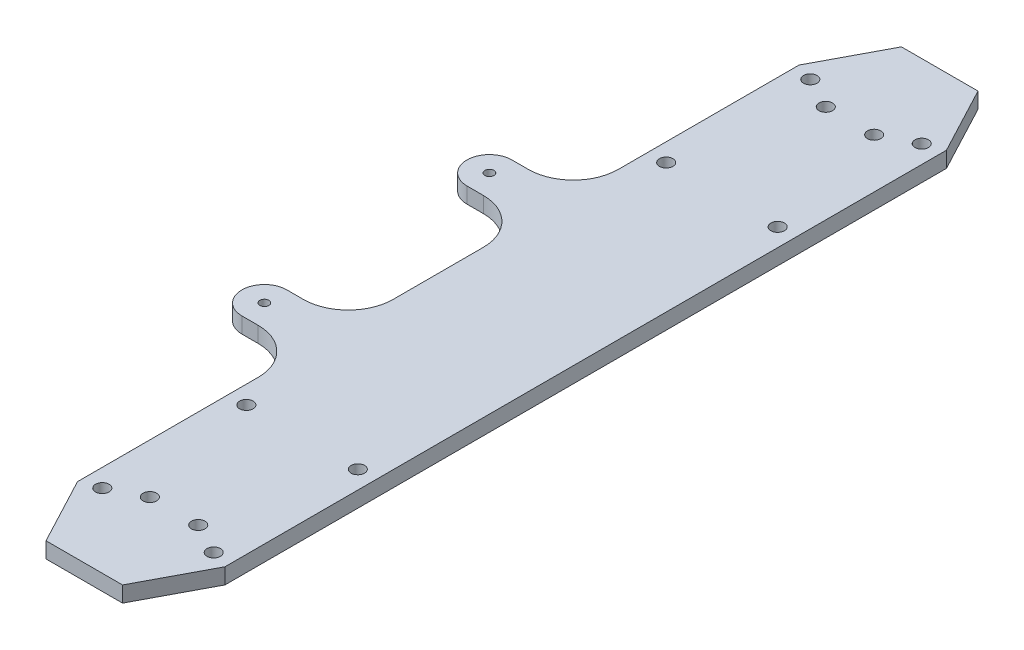
ISO-10303-21;
HEADER;
FILE_DESCRIPTION(('STEP AP214'),'2;1');
FILE_NAME('part.step','',(''),(''),'','','');
FILE_SCHEMA(('AUTOMOTIVE_DESIGN { 1 0 10303 214 1 1 1 1 }'));
ENDSEC;
DATA;
#1=APPLICATION_CONTEXT('core data for automotive mechanical design processes');
#2=APPLICATION_PROTOCOL_DEFINITION('international standard','automotive_design',2000,#1);
#3=PRODUCT_CONTEXT('',#1,'mechanical');
#4=PRODUCT('Part','Part','',(#3));
#5=PRODUCT_RELATED_PRODUCT_CATEGORY('part','',(#4));
#6=PRODUCT_DEFINITION_FORMATION('','',#4);
#7=PRODUCT_DEFINITION_CONTEXT('part definition',#1,'design');
#8=PRODUCT_DEFINITION('design','',#6,#7);
#9=PRODUCT_DEFINITION_SHAPE('','',#8);
#10=(LENGTH_UNIT() NAMED_UNIT(*) SI_UNIT(.MILLI.,.METRE.));
#11=(NAMED_UNIT(*) PLANE_ANGLE_UNIT() SI_UNIT($,.RADIAN.));
#12=(NAMED_UNIT(*) SI_UNIT($,.STERADIAN.) SOLID_ANGLE_UNIT());
#13=UNCERTAINTY_MEASURE_WITH_UNIT(LENGTH_MEASURE(1.E-05),#10,'distance_accuracy_value','');
#14=(GEOMETRIC_REPRESENTATION_CONTEXT(3) GLOBAL_UNCERTAINTY_ASSIGNED_CONTEXT((#13)) GLOBAL_UNIT_ASSIGNED_CONTEXT((#10,
#11,#12)) REPRESENTATION_CONTEXT('',''));
#15=CARTESIAN_POINT('',(0.,0.,0.));
#16=DIRECTION('',(0.,0.,1.));
#17=DIRECTION('',(1.,0.,0.));
#18=AXIS2_PLACEMENT_3D('',#15,#16,#17);
#19=CARTESIAN_POINT('',(-26.375,3.5,-9.995));
#20=DIRECTION('',(0.,-1.,0.));
#21=DIRECTION('',(0.,0.,-1.));
#22=AXIS2_PLACEMENT_3D('',#19,#20,#21);
#23=CYLINDRICAL_SURFACE('',#22,10.);
#24=DIRECTION('',(0.,-1.,0.));
#25=VECTOR('',#24,1.);
#26=CARTESIAN_POINT('',(-16.375,3.5,-9.995));
#27=LINE('',#26,#25);
#28=CARTESIAN_POINT('',(-16.375,3.5,-9.995));
#29=VERTEX_POINT('',#28);
#30=CARTESIAN_POINT('',(-16.375,0.,-9.995));
#31=VERTEX_POINT('',#30);
#32=EDGE_CURVE('E399',#29,#31,#27,.T.);
#33=ORIENTED_EDGE('',*,*,#32,.F.);
#34=CARTESIAN_POINT('',(-26.375,3.5,-9.995));
#35=DIRECTION('',(0.,-1.,0.));
#36=DIRECTION('',(0.,0.,-1.));
#37=AXIS2_PLACEMENT_3D('',#34,#35,#36);
#38=CIRCLE('',#37,10.);
#39=CARTESIAN_POINT('',(-26.375,3.5,-19.995));
#40=VERTEX_POINT('',#39);
#41=EDGE_CURVE('E43',#29,#40,#38,.F.);
#42=ORIENTED_EDGE('',*,*,#41,.T.);
#43=DIRECTION('',(0.,-1.,0.));
#44=VECTOR('',#43,1.);
#45=CARTESIAN_POINT('',(-26.375,24.6441930562507,-19.995));
#46=LINE('',#45,#44);
#47=CARTESIAN_POINT('',(-26.375,0.,-19.995));
#48=VERTEX_POINT('',#47);
#49=EDGE_CURVE('E402',#48,#40,#46,.F.);
#50=ORIENTED_EDGE('',*,*,#49,.F.);
#51=CARTESIAN_POINT('',(-26.375,0.,-9.995));
#52=DIRECTION('',(0.,-1.,0.));
#53=DIRECTION('',(0.,0.,-1.));
#54=AXIS2_PLACEMENT_3D('',#51,#52,#53);
#55=CIRCLE('',#54,10.);
#56=EDGE_CURVE('E11',#48,#31,#55,.T.);
#57=ORIENTED_EDGE('',*,*,#56,.T.);
#58=EDGE_LOOP('',(#33,#42,#50,#57));
#59=FACE_BOUND('',#58,.T.);
#60=ADVANCED_FACE('F36',(#59),#23,.F.);
#61=CARTESIAN_POINT('',(-26.375,3.5,-39.995));
#62=DIRECTION('',(0.,-1.,0.));
#63=DIRECTION('',(0.,0.,-1.));
#64=AXIS2_PLACEMENT_3D('',#61,#62,#63);
#65=CYLINDRICAL_SURFACE('',#64,10.);
#66=DIRECTION('',(0.,1.,0.));
#67=VECTOR('',#66,1.);
#68=CARTESIAN_POINT('',(-16.375,3.5,-39.995));
#69=LINE('',#68,#67);
#70=CARTESIAN_POINT('',(-16.375,0.,-39.995));
#71=VERTEX_POINT('',#70);
#72=CARTESIAN_POINT('',(-16.375,3.5,-39.995));
#73=VERTEX_POINT('',#72);
#74=EDGE_CURVE('E391',#71,#73,#69,.T.);
#75=ORIENTED_EDGE('',*,*,#74,.F.);
#76=CARTESIAN_POINT('',(-26.375,0.,-39.995));
#77=DIRECTION('',(0.,-1.,0.));
#78=DIRECTION('',(0.,0.,-1.));
#79=AXIS2_PLACEMENT_3D('',#76,#77,#78);
#80=CIRCLE('',#79,10.);
#81=CARTESIAN_POINT('',(-26.375,0.,-29.995));
#82=VERTEX_POINT('',#81);
#83=EDGE_CURVE('E395',#71,#82,#80,.T.);
#84=ORIENTED_EDGE('',*,*,#83,.T.);
#85=DIRECTION('',(0.,1.,0.));
#86=VECTOR('',#85,1.);
#87=CARTESIAN_POINT('',(-26.375,3.5,-29.995));
#88=LINE('',#87,#86);
#89=CARTESIAN_POINT('',(-26.375,3.5,-29.995));
#90=VERTEX_POINT('',#89);
#91=EDGE_CURVE('E176',#90,#82,#88,.F.);
#92=ORIENTED_EDGE('',*,*,#91,.F.);
#93=CARTESIAN_POINT('',(-26.375,3.5,-39.995));
#94=DIRECTION('',(0.,-1.,0.));
#95=DIRECTION('',(0.,0.,-1.));
#96=AXIS2_PLACEMENT_3D('',#93,#94,#95);
#97=CIRCLE('',#96,10.);
#98=EDGE_CURVE('E397',#90,#73,#97,.F.);
#99=ORIENTED_EDGE('',*,*,#98,.T.);
#100=EDGE_LOOP('',(#75,#84,#92,#99));
#101=FACE_BOUND('',#100,.T.);
#102=ADVANCED_FACE('F434',(#101),#65,.F.);
#103=CARTESIAN_POINT('',(-16.375,3.5,95.0000000000001));
#104=DIRECTION('',(1.,0.,0.));
#105=DIRECTION('',(0.,0.,-1.));
#106=AXIS2_PLACEMENT_3D('',#103,#104,#105);
#107=PLANE('',#106);
#108=DIRECTION('',(0.,0.,1.));
#109=VECTOR('',#108,1.);
#110=CARTESIAN_POINT('',(-16.375,0.,95.0000000000001));
#111=LINE('',#110,#109);
#112=CARTESIAN_POINT('',(-16.375,0.,-80.125));
#113=VERTEX_POINT('',#112);
#114=EDGE_CURVE('E360',#113,#71,#111,.T.);
#115=ORIENTED_EDGE('',*,*,#114,.T.);
#116=ORIENTED_EDGE('',*,*,#74,.T.);
#117=DIRECTION('',(0.,0.,1.));
#118=VECTOR('',#117,1.);
#119=CARTESIAN_POINT('',(-16.375,3.5,95.0000000000001));
#120=LINE('',#119,#118);
#121=CARTESIAN_POINT('',(-16.375,3.5,-80.125));
#122=VERTEX_POINT('',#121);
#123=EDGE_CURVE('E347',#122,#73,#120,.T.);
#124=ORIENTED_EDGE('',*,*,#123,.F.);
#125=DIRECTION('',(0.,1.,0.));
#126=VECTOR('',#125,1.);
#127=CARTESIAN_POINT('',(-16.375,0.,-80.125));
#128=LINE('',#127,#126);
#129=EDGE_CURVE('E298',#113,#122,#128,.T.);
#130=ORIENTED_EDGE('',*,*,#129,.F.);
#131=EDGE_LOOP('',(#115,#116,#124,#130));
#132=FACE_BOUND('',#131,.T.);
#133=ADVANCED_FACE('F431',(#132),#107,.F.);
#134=CARTESIAN_POINT('',(-26.375,24.6441930562507,9.995));
#135=DIRECTION('',(0.,1.,0.));
#136=DIRECTION('',(0.,0.,1.));
#137=AXIS2_PLACEMENT_3D('',#134,#135,#136);
#138=CYLINDRICAL_SURFACE('',#137,10.);
#139=DIRECTION('',(0.,-1.,0.));
#140=VECTOR('',#139,1.);
#141=CARTESIAN_POINT('',(-26.375,24.6441930562507,19.995));
#142=LINE('',#141,#140);
#143=CARTESIAN_POINT('',(-26.375,3.5,19.995));
#144=VERTEX_POINT('',#143);
#145=CARTESIAN_POINT('',(-26.375,0.,19.995));
#146=VERTEX_POINT('',#145);
#147=EDGE_CURVE('E380',#144,#146,#142,.T.);
#148=ORIENTED_EDGE('',*,*,#147,.F.);
#149=CARTESIAN_POINT('',(-26.375,3.5,9.995));
#150=DIRECTION('',(0.,-1.,0.));
#151=DIRECTION('',(0.,0.,-1.));
#152=AXIS2_PLACEMENT_3D('',#149,#150,#151);
#153=CIRCLE('',#152,10.);
#154=CARTESIAN_POINT('',(-16.375,3.5,9.995));
#155=VERTEX_POINT('',#154);
#156=EDGE_CURVE('E386',#144,#155,#153,.F.);
#157=ORIENTED_EDGE('',*,*,#156,.T.);
#158=DIRECTION('',(0.,-1.,0.));
#159=VECTOR('',#158,1.);
#160=CARTESIAN_POINT('',(-16.375,24.6441930562507,9.995));
#161=LINE('',#160,#159);
#162=CARTESIAN_POINT('',(-16.375,0.,9.995));
#163=VERTEX_POINT('',#162);
#164=EDGE_CURVE('E383',#163,#155,#161,.F.);
#165=ORIENTED_EDGE('',*,*,#164,.F.);
#166=CARTESIAN_POINT('',(-26.375,0.,9.995));
#167=DIRECTION('',(0.,-1.,0.));
#168=DIRECTION('',(0.,0.,-1.));
#169=AXIS2_PLACEMENT_3D('',#166,#167,#168);
#170=CIRCLE('',#169,10.);
#171=EDGE_CURVE('E389',#163,#146,#170,.T.);
#172=ORIENTED_EDGE('',*,*,#171,.T.);
#173=EDGE_LOOP('',(#148,#157,#165,#172));
#174=FACE_BOUND('',#173,.T.);
#175=ADVANCED_FACE('F456',(#174),#138,.F.);
#176=CARTESIAN_POINT('',(-26.375,24.6441930562507,39.995));
#177=DIRECTION('',(0.,1.,0.));
#178=DIRECTION('',(0.,0.,1.));
#179=AXIS2_PLACEMENT_3D('',#176,#177,#178);
#180=CYLINDRICAL_SURFACE('',#179,10.);
#181=DIRECTION('',(0.,1.,0.));
#182=VECTOR('',#181,1.);
#183=CARTESIAN_POINT('',(-26.375,24.6441930562507,29.995));
#184=LINE('',#183,#182);
#185=CARTESIAN_POINT('',(-26.375,0.,29.995));
#186=VERTEX_POINT('',#185);
#187=CARTESIAN_POINT('',(-26.375,3.5,29.995));
#188=VERTEX_POINT('',#187);
#189=EDGE_CURVE('E359',#186,#188,#184,.T.);
#190=ORIENTED_EDGE('',*,*,#189,.F.);
#191=CARTESIAN_POINT('',(-26.375,0.,39.995));
#192=DIRECTION('',(0.,-1.,0.));
#193=DIRECTION('',(0.,0.,-1.));
#194=AXIS2_PLACEMENT_3D('',#191,#192,#193);
#195=CIRCLE('',#194,10.);
#196=CARTESIAN_POINT('',(-16.375,0.,39.995));
#197=VERTEX_POINT('',#196);
#198=EDGE_CURVE('E376',#186,#197,#195,.T.);
#199=ORIENTED_EDGE('',*,*,#198,.T.);
#200=DIRECTION('',(0.,1.,0.));
#201=VECTOR('',#200,1.);
#202=CARTESIAN_POINT('',(-16.375,3.5,39.995));
#203=LINE('',#202,#201);
#204=CARTESIAN_POINT('',(-16.375,3.5,39.995));
#205=VERTEX_POINT('',#204);
#206=EDGE_CURVE('E373',#205,#197,#203,.F.);
#207=ORIENTED_EDGE('',*,*,#206,.F.);
#208=CARTESIAN_POINT('',(-26.375,3.5,39.995));
#209=DIRECTION('',(0.,-1.,0.));
#210=DIRECTION('',(0.,0.,-1.));
#211=AXIS2_PLACEMENT_3D('',#208,#209,#210);
#212=CIRCLE('',#211,10.);
#213=EDGE_CURVE('E378',#205,#188,#212,.F.);
#214=ORIENTED_EDGE('',*,*,#213,.T.);
#215=EDGE_LOOP('',(#190,#199,#207,#214));
#216=FACE_BOUND('',#215,.T.);
#217=ADVANCED_FACE('F427',(#216),#180,.F.);
#218=EDGE_CURVE('E351',#29,#155,#120,.T.);
#219=ORIENTED_EDGE('',*,*,#218,.F.);
#220=ORIENTED_EDGE('',*,*,#32,.T.);
#221=EDGE_CURVE('E364',#31,#163,#111,.T.);
#222=ORIENTED_EDGE('',*,*,#221,.T.);
#223=ORIENTED_EDGE('',*,*,#164,.T.);
#224=EDGE_LOOP('',(#219,#220,#222,#223));
#225=FACE_BOUND('',#224,.T.);
#226=ADVANCED_FACE('F419',(#225),#107,.F.);
#227=CARTESIAN_POINT('',(0.,3.5,0.));
#228=DIRECTION('',(0.,-1.,0.));
#229=DIRECTION('',(0.,0.,-1.));
#230=AXIS2_PLACEMENT_3D('',#227,#228,#229);
#231=PLANE('',#230);
#232=DIRECTION('',(0.,0.,-1.));
#233=VECTOR('',#232,1.);
#234=CARTESIAN_POINT('',(16.375,3.5,95.0000000000001));
#235=LINE('',#234,#233);
#236=CARTESIAN_POINT('',(16.375,3.5,80.125));
#237=VERTEX_POINT('',#236);
#238=CARTESIAN_POINT('',(16.375,3.5,-80.125));
#239=VERTEX_POINT('',#238);
#240=EDGE_CURVE('E355',#237,#239,#235,.T.);
#241=ORIENTED_EDGE('',*,*,#240,.T.);
#242=DIRECTION('',(-0.467887720419032,0.,-0.883787916347062));
#243=VECTOR('',#242,1.);
#244=CARTESIAN_POINT('',(45.9229729729729,3.5,-24.3121621621621));
#245=LINE('',#244,#243);
#246=CARTESIAN_POINT('',(8.5,3.5,-95.0000000000001));
#247=VERTEX_POINT('',#246);
#248=EDGE_CURVE('E261',#239,#247,#245,.T.);
#249=ORIENTED_EDGE('',*,*,#248,.T.);
#250=DIRECTION('',(-1.,0.,0.));
#251=VECTOR('',#250,1.);
#252=CARTESIAN_POINT('',(-16.375,3.5,-94.9999999999999));
#253=LINE('',#252,#251);
#254=CARTESIAN_POINT('',(-8.5,3.5,-94.9999999999999));
#255=VERTEX_POINT('',#254);
#256=EDGE_CURVE('E357',#247,#255,#253,.T.);
#257=ORIENTED_EDGE('',*,*,#256,.T.);
#258=DIRECTION('',(0.467887720419032,0.,-0.883787916347062));
#259=VECTOR('',#258,1.);
#260=CARTESIAN_POINT('',(-45.9229729729729,3.5,-24.3121621621621));
#261=LINE('',#260,#259);
#262=EDGE_CURVE('E283',#122,#255,#261,.T.);
#263=ORIENTED_EDGE('',*,*,#262,.F.);
#264=ORIENTED_EDGE('',*,*,#123,.T.);
#265=ORIENTED_EDGE('',*,*,#98,.F.);
#266=DIRECTION('',(1.,0.,0.));
#267=VECTOR('',#266,1.);
#268=CARTESIAN_POINT('',(0.,3.5,-29.995));
#269=LINE('',#268,#267);
#270=CARTESIAN_POINT('',(-30.005,3.5,-29.995));
#271=VERTEX_POINT('',#270);
#272=EDGE_CURVE('E201',#271,#90,#269,.T.);
#273=ORIENTED_EDGE('',*,*,#272,.F.);
#274=CARTESIAN_POINT('',(-30.005,3.5,-24.995));
#275=DIRECTION('',(0.,-1.,0.));
#276=DIRECTION('',(0.,0.,-1.));
#277=AXIS2_PLACEMENT_3D('',#274,#275,#276);
#278=CIRCLE('',#277,5.);
#279=CARTESIAN_POINT('',(-30.005,3.5,-19.995));
#280=VERTEX_POINT('',#279);
#281=EDGE_CURVE('E186',#280,#271,#278,.T.);
#282=ORIENTED_EDGE('',*,*,#281,.F.);
#283=DIRECTION('',(1.,0.,0.));
#284=VECTOR('',#283,1.);
#285=CARTESIAN_POINT('',(0.,3.5,-19.995));
#286=LINE('',#285,#284);
#287=EDGE_CURVE('E204',#280,#40,#286,.T.);
#288=ORIENTED_EDGE('',*,*,#287,.T.);
#289=ORIENTED_EDGE('',*,*,#41,.F.);
#290=ORIENTED_EDGE('',*,*,#218,.T.);
#291=ORIENTED_EDGE('',*,*,#156,.F.);
#292=DIRECTION('',(1.,0.,0.));
#293=VECTOR('',#292,1.);
#294=CARTESIAN_POINT('',(0.,3.5,19.995));
#295=LINE('',#294,#293);
#296=CARTESIAN_POINT('',(-30.005,3.5,19.995));
#297=VERTEX_POINT('',#296);
#298=EDGE_CURVE('E209',#297,#144,#295,.T.);
#299=ORIENTED_EDGE('',*,*,#298,.F.);
#300=CARTESIAN_POINT('',(-30.005,3.5,24.995));
#301=DIRECTION('',(0.,-1.,0.));
#302=DIRECTION('',(0.,0.,-1.));
#303=AXIS2_PLACEMENT_3D('',#300,#301,#302);
#304=CIRCLE('',#303,5.);
#305=CARTESIAN_POINT('',(-30.005,3.5,29.995));
#306=VERTEX_POINT('',#305);
#307=EDGE_CURVE('E208',#297,#306,#304,.F.);
#308=ORIENTED_EDGE('',*,*,#307,.T.);
#309=DIRECTION('',(1.,0.,0.));
#310=VECTOR('',#309,1.);
#311=CARTESIAN_POINT('',(0.,3.5,29.995));
#312=LINE('',#311,#310);
#313=EDGE_CURVE('E205',#306,#188,#312,.T.);
#314=ORIENTED_EDGE('',*,*,#313,.T.);
#315=ORIENTED_EDGE('',*,*,#213,.F.);
#316=CARTESIAN_POINT('',(-16.375,3.5,80.125));
#317=VERTEX_POINT('',#316);
#318=EDGE_CURVE('E352',#205,#317,#120,.T.);
#319=ORIENTED_EDGE('',*,*,#318,.T.);
#320=DIRECTION('',(0.467887720419032,0.,0.883787916347062));
#321=VECTOR('',#320,1.);
#322=CARTESIAN_POINT('',(-45.9229729729729,3.5,24.3121621621621));
#323=LINE('',#322,#321);
#324=CARTESIAN_POINT('',(-8.5,3.5,95.0000000000001));
#325=VERTEX_POINT('',#324);
#326=EDGE_CURVE('E328',#317,#325,#323,.T.);
#327=ORIENTED_EDGE('',*,*,#326,.T.);
#328=DIRECTION('',(1.,0.,0.));
#329=VECTOR('',#328,1.);
#330=CARTESIAN_POINT('',(-16.375,3.5,95.0000000000001));
#331=LINE('',#330,#329);
#332=CARTESIAN_POINT('',(8.5,3.5,95.0000000000001));
#333=VERTEX_POINT('',#332);
#334=EDGE_CURVE('E350',#325,#333,#331,.T.);
#335=ORIENTED_EDGE('',*,*,#334,.T.);
#336=DIRECTION('',(-0.467887720419032,0.,0.883787916347062));
#337=VECTOR('',#336,1.);
#338=CARTESIAN_POINT('',(45.9229729729729,3.5,24.3121621621621));
#339=LINE('',#338,#337);
#340=EDGE_CURVE('E306',#237,#333,#339,.T.);
#341=ORIENTED_EDGE('',*,*,#340,.F.);
#342=EDGE_LOOP('',(#241,#249,#257,#263,#264,#265,#273,#282,#288,#289,#290,#291,#299,#308,#314,
#315,#319,#327,#335,#341));
#343=FACE_BOUND('',#342,.T.);
#344=CARTESIAN_POINT('',(-5.375,3.5,-75.065));
#345=DIRECTION('',(0.,1.,0.));
#346=DIRECTION('',(0.,0.,-1.));
#347=AXIS2_PLACEMENT_3D('',#344,#345,#346);
#348=CIRCLE('',#347,1.5);
#349=CARTESIAN_POINT('',(-5.375,3.5,-76.565));
#350=VERTEX_POINT('',#349);
#351=EDGE_CURVE('E214',#350,#350,#348,.T.);
#352=ORIENTED_EDGE('',*,*,#351,.F.);
#353=EDGE_LOOP('',(#352));
#354=FACE_BOUND('',#353,.T.);
#355=CARTESIAN_POINT('',(5.375,3.5,-75.065));
#356=DIRECTION('',(0.,-1.,0.));
#357=DIRECTION('',(0.,0.,-1.));
#358=AXIS2_PLACEMENT_3D('',#355,#356,#357);
#359=CIRCLE('',#358,1.5);
#360=CARTESIAN_POINT('',(5.375,3.5,-76.565));
#361=VERTEX_POINT('',#360);
#362=EDGE_CURVE('E237',#361,#361,#359,.T.);
#363=ORIENTED_EDGE('',*,*,#362,.T.);
#364=EDGE_LOOP('',(#363));
#365=FACE_BOUND('',#364,.T.);
#366=CARTESIAN_POINT('',(-5.375,3.5,75.065));
#367=DIRECTION('',(0.,-1.,0.));
#368=DIRECTION('',(0.,0.,1.));
#369=AXIS2_PLACEMENT_3D('',#366,#367,#368);
#370=CIRCLE('',#369,1.5);
#371=CARTESIAN_POINT('',(-5.375,3.5,76.565));
#372=VERTEX_POINT('',#371);
#373=EDGE_CURVE('E243',#372,#372,#370,.T.);
#374=ORIENTED_EDGE('',*,*,#373,.T.);
#375=EDGE_LOOP('',(#374));
#376=FACE_BOUND('',#375,.T.);
#377=CARTESIAN_POINT('',(5.375,3.5,75.065));
#378=DIRECTION('',(0.,1.,0.));
#379=DIRECTION('',(0.,0.,1.));
#380=AXIS2_PLACEMENT_3D('',#377,#378,#379);
#381=CIRCLE('',#380,1.5);
#382=CARTESIAN_POINT('',(5.375,3.5,76.565));
#383=VERTEX_POINT('',#382);
#384=EDGE_CURVE('E249',#383,#383,#381,.T.);
#385=ORIENTED_EDGE('',*,*,#384,.F.);
#386=EDGE_LOOP('',(#385));
#387=FACE_BOUND('',#386,.T.);
#388=CARTESIAN_POINT('',(12.375,3.5,-46.625));
#389=DIRECTION('',(0.,1.,0.));
#390=DIRECTION('',(0.,0.,-1.));
#391=AXIS2_PLACEMENT_3D('',#388,#389,#390);
#392=CIRCLE('',#391,1.5);
#393=CARTESIAN_POINT('',(12.375,3.5,-48.125));
#394=VERTEX_POINT('',#393);
#395=EDGE_CURVE('E255',#394,#394,#392,.T.);
#396=ORIENTED_EDGE('',*,*,#395,.F.);
#397=EDGE_LOOP('',(#396));
#398=FACE_BOUND('',#397,.T.);
#399=CARTESIAN_POINT('',(12.375,3.5,-78.625));
#400=DIRECTION('',(0.,1.,0.));
#401=DIRECTION('',(0.,0.,-1.));
#402=AXIS2_PLACEMENT_3D('',#399,#400,#401);
#403=CIRCLE('',#402,1.5);
#404=CARTESIAN_POINT('',(12.375,3.5,-80.125));
#405=VERTEX_POINT('',#404);
#406=EDGE_CURVE('E262',#405,#405,#403,.T.);
#407=ORIENTED_EDGE('',*,*,#406,.F.);
#408=EDGE_LOOP('',(#407));
#409=FACE_BOUND('',#408,.T.);
#410=CARTESIAN_POINT('',(-12.375,3.5,-46.625));
#411=DIRECTION('',(0.,-1.,0.));
#412=DIRECTION('',(0.,0.,-1.));
#413=AXIS2_PLACEMENT_3D('',#410,#411,#412);
#414=CIRCLE('',#413,1.5);
#415=CARTESIAN_POINT('',(-12.375,3.5,-48.125));
#416=VERTEX_POINT('',#415);
#417=EDGE_CURVE('E277',#416,#416,#414,.T.);
#418=ORIENTED_EDGE('',*,*,#417,.T.);
#419=EDGE_LOOP('',(#418));
#420=FACE_BOUND('',#419,.T.);
#421=CARTESIAN_POINT('',(-12.375,3.5,-78.625));
#422=DIRECTION('',(0.,-1.,0.));
#423=DIRECTION('',(0.,0.,-1.));
#424=AXIS2_PLACEMENT_3D('',#421,#422,#423);
#425=CIRCLE('',#424,1.5);
#426=CARTESIAN_POINT('',(-12.375,3.5,-80.125));
#427=VERTEX_POINT('',#426);
#428=EDGE_CURVE('E284',#427,#427,#425,.T.);
#429=ORIENTED_EDGE('',*,*,#428,.T.);
#430=EDGE_LOOP('',(#429));
#431=FACE_BOUND('',#430,.T.);
#432=CARTESIAN_POINT('',(12.375,3.5,46.625));
#433=DIRECTION('',(0.,-1.,0.));
#434=DIRECTION('',(0.,0.,1.));
#435=AXIS2_PLACEMENT_3D('',#432,#433,#434);
#436=CIRCLE('',#435,1.5);
#437=CARTESIAN_POINT('',(12.375,3.5,48.125));
#438=VERTEX_POINT('',#437);
#439=EDGE_CURVE('E300',#438,#438,#436,.T.);
#440=ORIENTED_EDGE('',*,*,#439,.T.);
#441=EDGE_LOOP('',(#440));
#442=FACE_BOUND('',#441,.T.);
#443=CARTESIAN_POINT('',(12.375,3.5,78.625));
#444=DIRECTION('',(0.,-1.,0.));
#445=DIRECTION('',(0.,0.,1.));
#446=AXIS2_PLACEMENT_3D('',#443,#444,#445);
#447=CIRCLE('',#446,1.5);
#448=CARTESIAN_POINT('',(12.375,3.5,80.125));
#449=VERTEX_POINT('',#448);
#450=EDGE_CURVE('E307',#449,#449,#447,.T.);
#451=ORIENTED_EDGE('',*,*,#450,.T.);
#452=EDGE_LOOP('',(#451));
#453=FACE_BOUND('',#452,.T.);
#454=CARTESIAN_POINT('',(-12.375,3.5,78.625));
#455=DIRECTION('',(0.,1.,0.));
#456=DIRECTION('',(0.,0.,1.));
#457=AXIS2_PLACEMENT_3D('',#454,#455,#456);
#458=CIRCLE('',#457,1.5);
#459=CARTESIAN_POINT('',(-12.375,3.5,80.125));
#460=VERTEX_POINT('',#459);
#461=EDGE_CURVE('E325',#460,#460,#458,.T.);
#462=ORIENTED_EDGE('',*,*,#461,.F.);
#463=EDGE_LOOP('',(#462));
#464=FACE_BOUND('',#463,.T.);
#465=CARTESIAN_POINT('',(-12.375,3.5,46.625));
#466=DIRECTION('',(0.,1.,0.));
#467=DIRECTION('',(0.,0.,1.));
#468=AXIS2_PLACEMENT_3D('',#465,#466,#467);
#469=CIRCLE('',#468,1.5);
#470=CARTESIAN_POINT('',(-12.375,3.5,48.125));
#471=VERTEX_POINT('',#470);
#472=EDGE_CURVE('E332',#471,#471,#469,.T.);
#473=ORIENTED_EDGE('',*,*,#472,.F.);
#474=EDGE_LOOP('',(#473));
#475=FACE_BOUND('',#474,.T.);
#476=CARTESIAN_POINT('',(-30.005,3.5,24.995));
#477=DIRECTION('',(0.,-1.,0.));
#478=DIRECTION('',(0.,0.,-1.));
#479=AXIS2_PLACEMENT_3D('',#476,#477,#478);
#480=CIRCLE('',#479,1.);
#481=CARTESIAN_POINT('',(-30.005,3.5,23.995));
#482=VERTEX_POINT('',#481);
#483=EDGE_CURVE('E211',#482,#482,#480,.T.);
#484=ORIENTED_EDGE('',*,*,#483,.T.);
#485=EDGE_LOOP('',(#484));
#486=FACE_BOUND('',#485,.T.);
#487=CARTESIAN_POINT('',(-30.005,3.5,-24.995));
#488=DIRECTION('',(0.,-1.,0.));
#489=DIRECTION('',(0.,0.,-1.));
#490=AXIS2_PLACEMENT_3D('',#487,#488,#489);
#491=CIRCLE('',#490,1.);
#492=CARTESIAN_POINT('',(-30.005,3.5,-25.995));
#493=VERTEX_POINT('',#492);
#494=EDGE_CURVE('E219',#493,#493,#491,.F.);
#495=ORIENTED_EDGE('',*,*,#494,.F.);
#496=EDGE_LOOP('',(#495));
#497=FACE_BOUND('',#496,.T.);
#498=ADVANCED_FACE('F408',(#343,#354,#365,#376,#387,#398,#409,#420,#431,#442,#453,#464,#475,
#486,#497),#231,.F.);
#499=CARTESIAN_POINT('',(0.,0.,0.));
#500=DIRECTION('',(0.,-1.,0.));
#501=DIRECTION('',(0.,0.,-1.));
#502=AXIS2_PLACEMENT_3D('',#499,#500,#501);
#503=PLANE('',#502);
#504=DIRECTION('',(-0.467887720419032,0.,-0.883787916347062));
#505=VECTOR('',#504,1.);
#506=CARTESIAN_POINT('',(45.9229729729729,0.,-24.3121621621621));
#507=LINE('',#506,#505);
#508=CARTESIAN_POINT('',(16.375,0.,-80.125));
#509=VERTEX_POINT('',#508);
#510=CARTESIAN_POINT('',(8.5,0.,-94.9999999999999));
#511=VERTEX_POINT('',#510);
#512=EDGE_CURVE('E270',#509,#511,#507,.T.);
#513=ORIENTED_EDGE('',*,*,#512,.F.);
#514=DIRECTION('',(0.,0.,-1.));
#515=VECTOR('',#514,1.);
#516=CARTESIAN_POINT('',(16.375,0.,95.0000000000001));
#517=LINE('',#516,#515);
#518=CARTESIAN_POINT('',(16.375,0.,80.125));
#519=VERTEX_POINT('',#518);
#520=EDGE_CURVE('E367',#519,#509,#517,.T.);
#521=ORIENTED_EDGE('',*,*,#520,.F.);
#522=DIRECTION('',(-0.467887720419032,0.,0.883787916347062));
#523=VECTOR('',#522,1.);
#524=CARTESIAN_POINT('',(45.9229729729729,0.,24.3121621621621));
#525=LINE('',#524,#523);
#526=CARTESIAN_POINT('',(8.5,0.,95.0000000000001));
#527=VERTEX_POINT('',#526);
#528=EDGE_CURVE('E315',#519,#527,#525,.T.);
#529=ORIENTED_EDGE('',*,*,#528,.T.);
#530=DIRECTION('',(1.,0.,0.));
#531=VECTOR('',#530,1.);
#532=CARTESIAN_POINT('',(-16.375,0.,95.0000000000001));
#533=LINE('',#532,#531);
#534=CARTESIAN_POINT('',(-8.5,0.,95.0000000000001));
#535=VERTEX_POINT('',#534);
#536=EDGE_CURVE('E363',#535,#527,#533,.T.);
#537=ORIENTED_EDGE('',*,*,#536,.F.);
#538=DIRECTION('',(0.467887720419032,0.,0.883787916347062));
#539=VECTOR('',#538,1.);
#540=CARTESIAN_POINT('',(-45.9229729729729,0.,24.3121621621621));
#541=LINE('',#540,#539);
#542=CARTESIAN_POINT('',(-16.375,0.,80.125));
#543=VERTEX_POINT('',#542);
#544=EDGE_CURVE('E337',#543,#535,#541,.T.);
#545=ORIENTED_EDGE('',*,*,#544,.F.);
#546=EDGE_CURVE('E344',#197,#543,#111,.T.);
#547=ORIENTED_EDGE('',*,*,#546,.F.);
#548=ORIENTED_EDGE('',*,*,#198,.F.);
#549=DIRECTION('',(-1.,0.,0.));
#550=VECTOR('',#549,1.);
#551=CARTESIAN_POINT('',(0.,0.,29.995));
#552=LINE('',#551,#550);
#553=CARTESIAN_POINT('',(-30.005,0.,29.995));
#554=VERTEX_POINT('',#553);
#555=EDGE_CURVE('E224',#186,#554,#552,.T.);
#556=ORIENTED_EDGE('',*,*,#555,.T.);
#557=CARTESIAN_POINT('',(-30.005,0.,24.995));
#558=DIRECTION('',(0.,1.,0.));
#559=DIRECTION('',(0.,0.,-1.));
#560=AXIS2_PLACEMENT_3D('',#557,#558,#559);
#561=CIRCLE('',#560,5.);
#562=CARTESIAN_POINT('',(-30.005,0.,19.995));
#563=VERTEX_POINT('',#562);
#564=EDGE_CURVE('E218',#554,#563,#561,.F.);
#565=ORIENTED_EDGE('',*,*,#564,.T.);
#566=DIRECTION('',(-1.,0.,0.));
#567=VECTOR('',#566,1.);
#568=CARTESIAN_POINT('',(0.,0.,19.995));
#569=LINE('',#568,#567);
#570=EDGE_CURVE('E222',#146,#563,#569,.T.);
#571=ORIENTED_EDGE('',*,*,#570,.F.);
#572=ORIENTED_EDGE('',*,*,#171,.F.);
#573=ORIENTED_EDGE('',*,*,#221,.F.);
#574=ORIENTED_EDGE('',*,*,#56,.F.);
#575=DIRECTION('',(-1.,0.,0.));
#576=VECTOR('',#575,1.);
#577=CARTESIAN_POINT('',(0.,0.,-19.995));
#578=LINE('',#577,#576);
#579=CARTESIAN_POINT('',(-30.005,0.,-19.995));
#580=VERTEX_POINT('',#579);
#581=EDGE_CURVE('E178',#48,#580,#578,.T.);
#582=ORIENTED_EDGE('',*,*,#581,.T.);
#583=CARTESIAN_POINT('',(-30.005,0.,-24.995));
#584=DIRECTION('',(0.,-1.,0.));
#585=DIRECTION('',(0.,0.,1.));
#586=AXIS2_PLACEMENT_3D('',#583,#584,#585);
#587=CIRCLE('',#586,5.);
#588=CARTESIAN_POINT('',(-30.005,0.,-29.995));
#589=VERTEX_POINT('',#588);
#590=EDGE_CURVE('E179',#589,#580,#587,.F.);
#591=ORIENTED_EDGE('',*,*,#590,.F.);
#592=DIRECTION('',(-1.,0.,0.));
#593=VECTOR('',#592,1.);
#594=CARTESIAN_POINT('',(0.,0.,-29.995));
#595=LINE('',#594,#593);
#596=EDGE_CURVE('E170',#82,#589,#595,.T.);
#597=ORIENTED_EDGE('',*,*,#596,.F.);
#598=ORIENTED_EDGE('',*,*,#83,.F.);
#599=ORIENTED_EDGE('',*,*,#114,.F.);
#600=DIRECTION('',(0.467887720419032,0.,-0.883787916347062));
#601=VECTOR('',#600,1.);
#602=CARTESIAN_POINT('',(-45.9229729729729,0.,-24.3121621621621));
#603=LINE('',#602,#601);
#604=CARTESIAN_POINT('',(-8.5,0.,-95.0000000000001));
#605=VERTEX_POINT('',#604);
#606=EDGE_CURVE('E292',#113,#605,#603,.T.);
#607=ORIENTED_EDGE('',*,*,#606,.T.);
#608=DIRECTION('',(-1.,0.,0.));
#609=VECTOR('',#608,1.);
#610=CARTESIAN_POINT('',(-16.375,0.,-94.9999999999999));
#611=LINE('',#610,#609);
#612=EDGE_CURVE('E369',#511,#605,#611,.T.);
#613=ORIENTED_EDGE('',*,*,#612,.F.);
#614=EDGE_LOOP('',(#513,#521,#529,#537,#545,#547,#548,#556,#565,#571,#572,#573,#574,#582,#591,
#597,#598,#599,#607,#613));
#615=FACE_BOUND('',#614,.T.);
#616=CARTESIAN_POINT('',(-5.375,0.,-75.065));
#617=DIRECTION('',(0.,1.,0.));
#618=DIRECTION('',(0.,0.,-1.));
#619=AXIS2_PLACEMENT_3D('',#616,#617,#618);
#620=CIRCLE('',#619,1.5);
#621=CARTESIAN_POINT('',(-5.375,0.,-76.565));
#622=VERTEX_POINT('',#621);
#623=EDGE_CURVE('E234',#622,#622,#620,.T.);
#624=ORIENTED_EDGE('',*,*,#623,.T.);
#625=EDGE_LOOP('',(#624));
#626=FACE_BOUND('',#625,.T.);
#627=CARTESIAN_POINT('',(5.375,0.,-75.065));
#628=DIRECTION('',(0.,-1.,0.));
#629=DIRECTION('',(0.,0.,-1.));
#630=AXIS2_PLACEMENT_3D('',#627,#628,#629);
#631=CIRCLE('',#630,1.5);
#632=CARTESIAN_POINT('',(5.375,0.,-76.565));
#633=VERTEX_POINT('',#632);
#634=EDGE_CURVE('E240',#633,#633,#631,.T.);
#635=ORIENTED_EDGE('',*,*,#634,.F.);
#636=EDGE_LOOP('',(#635));
#637=FACE_BOUND('',#636,.T.);
#638=CARTESIAN_POINT('',(-5.375,0.,75.065));
#639=DIRECTION('',(0.,-1.,0.));
#640=DIRECTION('',(0.,0.,1.));
#641=AXIS2_PLACEMENT_3D('',#638,#639,#640);
#642=CIRCLE('',#641,1.5);
#643=CARTESIAN_POINT('',(-5.375,0.,76.565));
#644=VERTEX_POINT('',#643);
#645=EDGE_CURVE('E246',#644,#644,#642,.T.);
#646=ORIENTED_EDGE('',*,*,#645,.F.);
#647=EDGE_LOOP('',(#646));
#648=FACE_BOUND('',#647,.T.);
#649=CARTESIAN_POINT('',(5.375,0.,75.065));
#650=DIRECTION('',(0.,1.,0.));
#651=DIRECTION('',(0.,0.,1.));
#652=AXIS2_PLACEMENT_3D('',#649,#650,#651);
#653=CIRCLE('',#652,1.5);
#654=CARTESIAN_POINT('',(5.375,0.,76.565));
#655=VERTEX_POINT('',#654);
#656=EDGE_CURVE('E252',#655,#655,#653,.T.);
#657=ORIENTED_EDGE('',*,*,#656,.T.);
#658=EDGE_LOOP('',(#657));
#659=FACE_BOUND('',#658,.T.);
#660=CARTESIAN_POINT('',(12.375,0.,-46.625));
#661=DIRECTION('',(0.,1.,0.));
#662=DIRECTION('',(0.,0.,-1.));
#663=AXIS2_PLACEMENT_3D('',#660,#661,#662);
#664=CIRCLE('',#663,1.5);
#665=CARTESIAN_POINT('',(12.375,0.,-48.125));
#666=VERTEX_POINT('',#665);
#667=EDGE_CURVE('E265',#666,#666,#664,.T.);
#668=ORIENTED_EDGE('',*,*,#667,.T.);
#669=EDGE_LOOP('',(#668));
#670=FACE_BOUND('',#669,.T.);
#671=CARTESIAN_POINT('',(12.375,0.,-78.625));
#672=DIRECTION('',(0.,1.,0.));
#673=DIRECTION('',(0.,0.,-1.));
#674=AXIS2_PLACEMENT_3D('',#671,#672,#673);
#675=CIRCLE('',#674,1.5);
#676=CARTESIAN_POINT('',(12.375,0.,-80.125));
#677=VERTEX_POINT('',#676);
#678=EDGE_CURVE('E258',#677,#677,#675,.T.);
#679=ORIENTED_EDGE('',*,*,#678,.T.);
#680=EDGE_LOOP('',(#679));
#681=FACE_BOUND('',#680,.T.);
#682=CARTESIAN_POINT('',(-12.375,0.,-78.625));
#683=DIRECTION('',(0.,-1.,0.));
#684=DIRECTION('',(0.,0.,-1.));
#685=AXIS2_PLACEMENT_3D('',#682,#683,#684);
#686=CIRCLE('',#685,1.5);
#687=CARTESIAN_POINT('',(-12.375,0.,-80.125));
#688=VERTEX_POINT('',#687);
#689=EDGE_CURVE('E280',#688,#688,#686,.T.);
#690=ORIENTED_EDGE('',*,*,#689,.F.);
#691=EDGE_LOOP('',(#690));
#692=FACE_BOUND('',#691,.T.);
#693=CARTESIAN_POINT('',(12.375,0.,78.625));
#694=DIRECTION('',(0.,-1.,0.));
#695=DIRECTION('',(0.,0.,1.));
#696=AXIS2_PLACEMENT_3D('',#693,#694,#695);
#697=CIRCLE('',#696,1.5);
#698=CARTESIAN_POINT('',(12.375,0.,80.125));
#699=VERTEX_POINT('',#698);
#700=EDGE_CURVE('E303',#699,#699,#697,.T.);
#701=ORIENTED_EDGE('',*,*,#700,.F.);
#702=EDGE_LOOP('',(#701));
#703=FACE_BOUND('',#702,.T.);
#704=CARTESIAN_POINT('',(-12.375,0.,46.625));
#705=DIRECTION('',(0.,1.,0.));
#706=DIRECTION('',(0.,0.,1.));
#707=AXIS2_PLACEMENT_3D('',#704,#705,#706);
#708=CIRCLE('',#707,1.5);
#709=CARTESIAN_POINT('',(-12.375,0.,48.125));
#710=VERTEX_POINT('',#709);
#711=EDGE_CURVE('E322',#710,#710,#708,.T.);
#712=ORIENTED_EDGE('',*,*,#711,.T.);
#713=EDGE_LOOP('',(#712));
#714=FACE_BOUND('',#713,.T.);
#715=CARTESIAN_POINT('',(-12.375,0.,78.625));
#716=DIRECTION('',(0.,1.,0.));
#717=DIRECTION('',(0.,0.,1.));
#718=AXIS2_PLACEMENT_3D('',#715,#716,#717);
#719=CIRCLE('',#718,1.5);
#720=CARTESIAN_POINT('',(-12.375,0.,80.125));
#721=VERTEX_POINT('',#720);
#722=EDGE_CURVE('E329',#721,#721,#719,.T.);
#723=ORIENTED_EDGE('',*,*,#722,.T.);
#724=EDGE_LOOP('',(#723));
#725=FACE_BOUND('',#724,.T.);
#726=CARTESIAN_POINT('',(12.375,0.,46.625));
#727=DIRECTION('',(0.,-1.,0.));
#728=DIRECTION('',(0.,0.,1.));
#729=AXIS2_PLACEMENT_3D('',#726,#727,#728);
#730=CIRCLE('',#729,1.5);
#731=CARTESIAN_POINT('',(12.375,0.,48.125));
#732=VERTEX_POINT('',#731);
#733=EDGE_CURVE('E310',#732,#732,#730,.T.);
#734=ORIENTED_EDGE('',*,*,#733,.F.);
#735=EDGE_LOOP('',(#734));
#736=FACE_BOUND('',#735,.T.);
#737=CARTESIAN_POINT('',(-12.375,0.,-46.625));
#738=DIRECTION('',(0.,-1.,0.));
#739=DIRECTION('',(0.,0.,-1.));
#740=AXIS2_PLACEMENT_3D('',#737,#738,#739);
#741=CIRCLE('',#740,1.5);
#742=CARTESIAN_POINT('',(-12.375,0.,-48.125));
#743=VERTEX_POINT('',#742);
#744=EDGE_CURVE('E287',#743,#743,#741,.T.);
#745=ORIENTED_EDGE('',*,*,#744,.F.);
#746=EDGE_LOOP('',(#745));
#747=FACE_BOUND('',#746,.T.);
#748=CARTESIAN_POINT('',(-30.005,0.,24.995));
#749=DIRECTION('',(0.,1.,0.));
#750=DIRECTION('',(0.,0.,-1.));
#751=AXIS2_PLACEMENT_3D('',#748,#749,#750);
#752=CIRCLE('',#751,1.);
#753=CARTESIAN_POINT('',(-30.005,0.,23.995));
#754=VERTEX_POINT('',#753);
#755=EDGE_CURVE('E215',#754,#754,#752,.T.);
#756=ORIENTED_EDGE('',*,*,#755,.T.);
#757=EDGE_LOOP('',(#756));
#758=FACE_BOUND('',#757,.T.);
#759=CARTESIAN_POINT('',(-30.005,0.,-24.995));
#760=DIRECTION('',(0.,-1.,0.));
#761=DIRECTION('',(0.,0.,1.));
#762=AXIS2_PLACEMENT_3D('',#759,#760,#761);
#763=CIRCLE('',#762,1.);
#764=CARTESIAN_POINT('',(-30.005,0.,-23.995));
#765=VERTEX_POINT('',#764);
#766=EDGE_CURVE('E194',#765,#765,#763,.T.);
#767=ORIENTED_EDGE('',*,*,#766,.F.);
#768=EDGE_LOOP('',(#767));
#769=FACE_BOUND('',#768,.T.);
#770=ADVANCED_FACE('F190',(#615,#626,#637,#648,#659,#670,#681,#692,#703,#714,#725,#736,#747,
#758,#769),#503,.T.);
#771=CARTESIAN_POINT('',(16.375,3.5,95.0000000000001));
#772=DIRECTION('',(-1.,0.,0.));
#773=DIRECTION('',(0.,0.,1.));
#774=AXIS2_PLACEMENT_3D('',#771,#772,#773);
#775=PLANE('',#774);
#776=DIRECTION('',(0.,1.,0.));
#777=VECTOR('',#776,1.);
#778=CARTESIAN_POINT('',(16.375,0.,-80.125));
#779=LINE('',#778,#777);
#780=EDGE_CURVE('E272',#509,#239,#779,.T.);
#781=ORIENTED_EDGE('',*,*,#780,.T.);
#782=ORIENTED_EDGE('',*,*,#240,.F.);
#783=DIRECTION('',(0.,1.,0.));
#784=VECTOR('',#783,1.);
#785=CARTESIAN_POINT('',(16.375,0.,80.125));
#786=LINE('',#785,#784);
#787=EDGE_CURVE('E320',#519,#237,#786,.T.);
#788=ORIENTED_EDGE('',*,*,#787,.F.);
#789=ORIENTED_EDGE('',*,*,#520,.T.);
#790=EDGE_LOOP('',(#781,#782,#788,#789));
#791=FACE_BOUND('',#790,.T.);
#792=ADVANCED_FACE('F425',(#791),#775,.F.);
#793=CARTESIAN_POINT('',(-16.375,3.5,-94.9999999999999));
#794=DIRECTION('',(0.,0.,1.));
#795=DIRECTION('',(1.,0.,0.));
#796=AXIS2_PLACEMENT_3D('',#793,#794,#795);
#797=PLANE('',#796);
#798=DIRECTION('',(0.,1.,0.));
#799=VECTOR('',#798,1.);
#800=CARTESIAN_POINT('',(8.5,0.,-95.0000000000001));
#801=LINE('',#800,#799);
#802=EDGE_CURVE('E275',#511,#247,#801,.T.);
#803=ORIENTED_EDGE('',*,*,#802,.F.);
#804=ORIENTED_EDGE('',*,*,#612,.T.);
#805=DIRECTION('',(0.,1.,0.));
#806=VECTOR('',#805,1.);
#807=CARTESIAN_POINT('',(-8.5,0.,-95.0000000000001));
#808=LINE('',#807,#806);
#809=EDGE_CURVE('E295',#605,#255,#808,.T.);
#810=ORIENTED_EDGE('',*,*,#809,.T.);
#811=ORIENTED_EDGE('',*,*,#256,.F.);
#812=EDGE_LOOP('',(#803,#804,#810,#811));
#813=FACE_BOUND('',#812,.T.);
#814=ADVANCED_FACE('F551',(#813),#797,.F.);
#815=ORIENTED_EDGE('',*,*,#318,.F.);
#816=ORIENTED_EDGE('',*,*,#206,.T.);
#817=ORIENTED_EDGE('',*,*,#546,.T.);
#818=DIRECTION('',(0.,1.,0.));
#819=VECTOR('',#818,1.);
#820=CARTESIAN_POINT('',(-16.375,0.,80.125));
#821=LINE('',#820,#819);
#822=EDGE_CURVE('E339',#543,#317,#821,.T.);
#823=ORIENTED_EDGE('',*,*,#822,.T.);
#824=EDGE_LOOP('',(#815,#816,#817,#823));
#825=FACE_BOUND('',#824,.T.);
#826=ADVANCED_FACE('F430',(#825),#107,.F.);
#827=CARTESIAN_POINT('',(-16.375,3.5,95.0000000000001));
#828=DIRECTION('',(0.,0.,-1.));
#829=DIRECTION('',(-1.,0.,0.));
#830=AXIS2_PLACEMENT_3D('',#827,#828,#829);
#831=PLANE('',#830);
#832=ORIENTED_EDGE('',*,*,#536,.T.);
#833=DIRECTION('',(0.,1.,0.));
#834=VECTOR('',#833,1.);
#835=CARTESIAN_POINT('',(8.5,0.,95.0000000000001));
#836=LINE('',#835,#834);
#837=EDGE_CURVE('E318',#527,#333,#836,.T.);
#838=ORIENTED_EDGE('',*,*,#837,.T.);
#839=ORIENTED_EDGE('',*,*,#334,.F.);
#840=DIRECTION('',(0.,1.,0.));
#841=VECTOR('',#840,1.);
#842=CARTESIAN_POINT('',(-8.5,0.,95.0000000000001));
#843=LINE('',#842,#841);
#844=EDGE_CURVE('E342',#535,#325,#843,.T.);
#845=ORIENTED_EDGE('',*,*,#844,.F.);
#846=EDGE_LOOP('',(#832,#838,#839,#845));
#847=FACE_BOUND('',#846,.T.);
#848=ADVANCED_FACE('F542',(#847),#831,.F.);
#849=CARTESIAN_POINT('',(-45.9229729729729,0.,24.3121621621621));
#850=DIRECTION('',(-0.883787916347062,0.,0.467887720419032));
#851=DIRECTION('',(0.467887720419032,0.,0.883787916347062));
#852=AXIS2_PLACEMENT_3D('',#849,#850,#851);
#853=PLANE('',#852);
#854=ORIENTED_EDGE('',*,*,#326,.F.);
#855=ORIENTED_EDGE('',*,*,#822,.F.);
#856=ORIENTED_EDGE('',*,*,#544,.T.);
#857=ORIENTED_EDGE('',*,*,#844,.T.);
#858=EDGE_LOOP('',(#854,#855,#856,#857));
#859=FACE_BOUND('',#858,.T.);
#860=ADVANCED_FACE('F448',(#859),#853,.T.);
#861=CARTESIAN_POINT('',(-12.375,0.,78.625));
#862=DIRECTION('',(0.,1.,0.));
#863=DIRECTION('',(0.,0.,1.));
#864=AXIS2_PLACEMENT_3D('',#861,#862,#863);
#865=CYLINDRICAL_SURFACE('',#864,1.5);
#866=ORIENTED_EDGE('',*,*,#722,.F.);
#867=EDGE_LOOP('',(#866));
#868=FACE_BOUND('',#867,.T.);
#869=ORIENTED_EDGE('',*,*,#461,.T.);
#870=EDGE_LOOP('',(#869));
#871=FACE_BOUND('',#870,.T.);
#872=ADVANCED_FACE('F535',(#868,#871),#865,.F.);
#873=CARTESIAN_POINT('',(-12.375,0.,46.625));
#874=DIRECTION('',(0.,1.,0.));
#875=DIRECTION('',(0.,0.,1.));
#876=AXIS2_PLACEMENT_3D('',#873,#874,#875);
#877=CYLINDRICAL_SURFACE('',#876,1.5);
#878=ORIENTED_EDGE('',*,*,#711,.F.);
#879=EDGE_LOOP('',(#878));
#880=FACE_BOUND('',#879,.T.);
#881=ORIENTED_EDGE('',*,*,#472,.T.);
#882=EDGE_LOOP('',(#881));
#883=FACE_BOUND('',#882,.T.);
#884=ADVANCED_FACE('F533',(#880,#883),#877,.F.);
#885=CARTESIAN_POINT('',(45.9229729729729,0.,24.3121621621621));
#886=DIRECTION('',(-0.883787916347062,0.,-0.467887720419032));
#887=DIRECTION('',(-0.467887720419032,0.,0.883787916347062));
#888=AXIS2_PLACEMENT_3D('',#885,#886,#887);
#889=PLANE('',#888);
#890=ORIENTED_EDGE('',*,*,#340,.T.);
#891=ORIENTED_EDGE('',*,*,#837,.F.);
#892=ORIENTED_EDGE('',*,*,#528,.F.);
#893=ORIENTED_EDGE('',*,*,#787,.T.);
#894=EDGE_LOOP('',(#890,#891,#892,#893));
#895=FACE_BOUND('',#894,.T.);
#896=ADVANCED_FACE('F526',(#895),#889,.F.);
#897=CARTESIAN_POINT('',(12.375,0.,78.625));
#898=DIRECTION('',(0.,1.,0.));
#899=DIRECTION('',(0.,0.,1.));
#900=AXIS2_PLACEMENT_3D('',#897,#898,#899);
#901=CYLINDRICAL_SURFACE('',#900,1.5);
#902=ORIENTED_EDGE('',*,*,#700,.T.);
#903=EDGE_LOOP('',(#902));
#904=FACE_BOUND('',#903,.T.);
#905=ORIENTED_EDGE('',*,*,#450,.F.);
#906=EDGE_LOOP('',(#905));
#907=FACE_BOUND('',#906,.T.);
#908=ADVANCED_FACE('F523',(#904,#907),#901,.F.);
#909=CARTESIAN_POINT('',(12.375,0.,46.625));
#910=DIRECTION('',(0.,1.,0.));
#911=DIRECTION('',(0.,0.,1.));
#912=AXIS2_PLACEMENT_3D('',#909,#910,#911);
#913=CYLINDRICAL_SURFACE('',#912,1.5);
#914=ORIENTED_EDGE('',*,*,#733,.T.);
#915=EDGE_LOOP('',(#914));
#916=FACE_BOUND('',#915,.T.);
#917=ORIENTED_EDGE('',*,*,#439,.F.);
#918=EDGE_LOOP('',(#917));
#919=FACE_BOUND('',#918,.T.);
#920=ADVANCED_FACE('F521',(#916,#919),#913,.F.);
#921=CARTESIAN_POINT('',(-45.9229729729729,0.,-24.3121621621621));
#922=DIRECTION('',(0.883787916347062,0.,0.467887720419032));
#923=DIRECTION('',(0.467887720419032,0.,-0.883787916347062));
#924=AXIS2_PLACEMENT_3D('',#921,#922,#923);
#925=PLANE('',#924);
#926=ORIENTED_EDGE('',*,*,#262,.T.);
#927=ORIENTED_EDGE('',*,*,#809,.F.);
#928=ORIENTED_EDGE('',*,*,#606,.F.);
#929=ORIENTED_EDGE('',*,*,#129,.T.);
#930=EDGE_LOOP('',(#926,#927,#928,#929));
#931=FACE_BOUND('',#930,.T.);
#932=ADVANCED_FACE('F514',(#931),#925,.F.);
#933=CARTESIAN_POINT('',(-12.375,0.,-78.625));
#934=DIRECTION('',(0.,1.,0.));
#935=DIRECTION('',(0.,0.,1.));
#936=AXIS2_PLACEMENT_3D('',#933,#934,#935);
#937=CYLINDRICAL_SURFACE('',#936,1.5);
#938=ORIENTED_EDGE('',*,*,#689,.T.);
#939=EDGE_LOOP('',(#938));
#940=FACE_BOUND('',#939,.T.);
#941=ORIENTED_EDGE('',*,*,#428,.F.);
#942=EDGE_LOOP('',(#941));
#943=FACE_BOUND('',#942,.T.);
#944=ADVANCED_FACE('F511',(#940,#943),#937,.F.);
#945=CARTESIAN_POINT('',(-12.375,0.,-46.625));
#946=DIRECTION('',(0.,1.,0.));
#947=DIRECTION('',(0.,0.,1.));
#948=AXIS2_PLACEMENT_3D('',#945,#946,#947);
#949=CYLINDRICAL_SURFACE('',#948,1.5);
#950=ORIENTED_EDGE('',*,*,#744,.T.);
#951=EDGE_LOOP('',(#950));
#952=FACE_BOUND('',#951,.T.);
#953=ORIENTED_EDGE('',*,*,#417,.F.);
#954=EDGE_LOOP('',(#953));
#955=FACE_BOUND('',#954,.T.);
#956=ADVANCED_FACE('F509',(#952,#955),#949,.F.);
#957=CARTESIAN_POINT('',(45.9229729729729,0.,-24.3121621621621));
#958=DIRECTION('',(0.883787916347062,0.,-0.467887720419032));
#959=DIRECTION('',(-0.467887720419032,0.,-0.883787916347062));
#960=AXIS2_PLACEMENT_3D('',#957,#958,#959);
#961=PLANE('',#960);
#962=ORIENTED_EDGE('',*,*,#248,.F.);
#963=ORIENTED_EDGE('',*,*,#780,.F.);
#964=ORIENTED_EDGE('',*,*,#512,.T.);
#965=ORIENTED_EDGE('',*,*,#802,.T.);
#966=EDGE_LOOP('',(#962,#963,#964,#965));
#967=FACE_BOUND('',#966,.T.);
#968=ADVANCED_FACE('F502',(#967),#961,.T.);
#969=CARTESIAN_POINT('',(12.375,0.,-78.625));
#970=DIRECTION('',(0.,1.,0.));
#971=DIRECTION('',(0.,0.,1.));
#972=AXIS2_PLACEMENT_3D('',#969,#970,#971);
#973=CYLINDRICAL_SURFACE('',#972,1.5);
#974=ORIENTED_EDGE('',*,*,#678,.F.);
#975=EDGE_LOOP('',(#974));
#976=FACE_BOUND('',#975,.T.);
#977=ORIENTED_EDGE('',*,*,#406,.T.);
#978=EDGE_LOOP('',(#977));
#979=FACE_BOUND('',#978,.T.);
#980=ADVANCED_FACE('F499',(#976,#979),#973,.F.);
#981=CARTESIAN_POINT('',(12.375,0.,-46.625));
#982=DIRECTION('',(0.,1.,0.));
#983=DIRECTION('',(0.,0.,1.));
#984=AXIS2_PLACEMENT_3D('',#981,#982,#983);
#985=CYLINDRICAL_SURFACE('',#984,1.5);
#986=ORIENTED_EDGE('',*,*,#667,.F.);
#987=EDGE_LOOP('',(#986));
#988=FACE_BOUND('',#987,.T.);
#989=ORIENTED_EDGE('',*,*,#395,.T.);
#990=EDGE_LOOP('',(#989));
#991=FACE_BOUND('',#990,.T.);
#992=ADVANCED_FACE('F497',(#988,#991),#985,.F.);
#993=CARTESIAN_POINT('',(5.375,0.,75.065));
#994=DIRECTION('',(0.,1.,0.));
#995=DIRECTION('',(0.,0.,1.));
#996=AXIS2_PLACEMENT_3D('',#993,#994,#995);
#997=CYLINDRICAL_SURFACE('',#996,1.5);
#998=ORIENTED_EDGE('',*,*,#656,.F.);
#999=EDGE_LOOP('',(#998));
#1000=FACE_BOUND('',#999,.T.);
#1001=ORIENTED_EDGE('',*,*,#384,.T.);
#1002=EDGE_LOOP('',(#1001));
#1003=FACE_BOUND('',#1002,.T.);
#1004=ADVANCED_FACE('F493',(#1000,#1003),#997,.F.);
#1005=CARTESIAN_POINT('',(-5.375,0.,75.065));
#1006=DIRECTION('',(0.,1.,0.));
#1007=DIRECTION('',(0.,0.,1.));
#1008=AXIS2_PLACEMENT_3D('',#1005,#1006,#1007);
#1009=CYLINDRICAL_SURFACE('',#1008,1.5);
#1010=ORIENTED_EDGE('',*,*,#645,.T.);
#1011=EDGE_LOOP('',(#1010));
#1012=FACE_BOUND('',#1011,.T.);
#1013=ORIENTED_EDGE('',*,*,#373,.F.);
#1014=EDGE_LOOP('',(#1013));
#1015=FACE_BOUND('',#1014,.T.);
#1016=ADVANCED_FACE('F489',(#1012,#1015),#1009,.F.);
#1017=CARTESIAN_POINT('',(5.375,0.,-75.065));
#1018=DIRECTION('',(0.,1.,0.));
#1019=DIRECTION('',(0.,0.,1.));
#1020=AXIS2_PLACEMENT_3D('',#1017,#1018,#1019);
#1021=CYLINDRICAL_SURFACE('',#1020,1.5);
#1022=ORIENTED_EDGE('',*,*,#634,.T.);
#1023=EDGE_LOOP('',(#1022));
#1024=FACE_BOUND('',#1023,.T.);
#1025=ORIENTED_EDGE('',*,*,#362,.F.);
#1026=EDGE_LOOP('',(#1025));
#1027=FACE_BOUND('',#1026,.T.);
#1028=ADVANCED_FACE('F485',(#1024,#1027),#1021,.F.);
#1029=CARTESIAN_POINT('',(-5.375,0.,-75.065));
#1030=DIRECTION('',(0.,1.,0.));
#1031=DIRECTION('',(0.,0.,1.));
#1032=AXIS2_PLACEMENT_3D('',#1029,#1030,#1031);
#1033=CYLINDRICAL_SURFACE('',#1032,1.5);
#1034=ORIENTED_EDGE('',*,*,#623,.F.);
#1035=EDGE_LOOP('',(#1034));
#1036=FACE_BOUND('',#1035,.T.);
#1037=ORIENTED_EDGE('',*,*,#351,.T.);
#1038=EDGE_LOOP('',(#1037));
#1039=FACE_BOUND('',#1038,.T.);
#1040=ADVANCED_FACE('F476',(#1036,#1039),#1033,.F.);
#1041=CARTESIAN_POINT('',(-30.005,24.6441930562507,24.995));
#1042=DIRECTION('',(0.,-1.,0.));
#1043=DIRECTION('',(0.,0.,-1.));
#1044=AXIS2_PLACEMENT_3D('',#1041,#1042,#1043);
#1045=CYLINDRICAL_SURFACE('',#1044,1.);
#1046=ORIENTED_EDGE('',*,*,#483,.F.);
#1047=EDGE_LOOP('',(#1046));
#1048=FACE_BOUND('',#1047,.T.);
#1049=ORIENTED_EDGE('',*,*,#755,.F.);
#1050=EDGE_LOOP('',(#1049));
#1051=FACE_BOUND('',#1050,.T.);
#1052=ADVANCED_FACE('F468',(#1048,#1051),#1045,.F.);
#1053=CARTESIAN_POINT('',(0.,24.6441930562507,19.995));
#1054=DIRECTION('',(0.,0.,1.));
#1055=DIRECTION('',(1.,0.,0.));
#1056=AXIS2_PLACEMENT_3D('',#1053,#1054,#1055);
#1057=PLANE('',#1056);
#1058=ORIENTED_EDGE('',*,*,#298,.T.);
#1059=ORIENTED_EDGE('',*,*,#147,.T.);
#1060=ORIENTED_EDGE('',*,*,#570,.T.);
#1061=DIRECTION('',(0.,-1.,0.));
#1062=VECTOR('',#1061,1.);
#1063=CARTESIAN_POINT('',(-30.005,24.6441930562507,19.995));
#1064=LINE('',#1063,#1062);
#1065=EDGE_CURVE('E226',#297,#563,#1064,.T.);
#1066=ORIENTED_EDGE('',*,*,#1065,.F.);
#1067=EDGE_LOOP('',(#1058,#1059,#1060,#1066));
#1068=FACE_BOUND('',#1067,.T.);
#1069=ADVANCED_FACE('F465',(#1068),#1057,.F.);
#1070=CARTESIAN_POINT('',(0.,24.6441930562507,29.995));
#1071=DIRECTION('',(0.,0.,1.));
#1072=DIRECTION('',(1.,0.,0.));
#1073=AXIS2_PLACEMENT_3D('',#1070,#1071,#1072);
#1074=PLANE('',#1073);
#1075=ORIENTED_EDGE('',*,*,#555,.F.);
#1076=ORIENTED_EDGE('',*,*,#189,.T.);
#1077=ORIENTED_EDGE('',*,*,#313,.F.);
#1078=DIRECTION('',(0.,-1.,0.));
#1079=VECTOR('',#1078,1.);
#1080=CARTESIAN_POINT('',(-30.005,24.6441930562507,29.995));
#1081=LINE('',#1080,#1079);
#1082=EDGE_CURVE('E227',#306,#554,#1081,.T.);
#1083=ORIENTED_EDGE('',*,*,#1082,.T.);
#1084=EDGE_LOOP('',(#1075,#1076,#1077,#1083));
#1085=FACE_BOUND('',#1084,.T.);
#1086=ADVANCED_FACE('F467',(#1085),#1074,.T.);
#1087=CARTESIAN_POINT('',(-30.005,24.6441930562507,24.995));
#1088=DIRECTION('',(0.,-1.,0.));
#1089=DIRECTION('',(0.,0.,-1.));
#1090=AXIS2_PLACEMENT_3D('',#1087,#1088,#1089);
#1091=CYLINDRICAL_SURFACE('',#1090,5.);
#1092=ORIENTED_EDGE('',*,*,#307,.F.);
#1093=ORIENTED_EDGE('',*,*,#1065,.T.);
#1094=ORIENTED_EDGE('',*,*,#564,.F.);
#1095=ORIENTED_EDGE('',*,*,#1082,.F.);
#1096=EDGE_LOOP('',(#1092,#1093,#1094,#1095));
#1097=FACE_BOUND('',#1096,.T.);
#1098=ADVANCED_FACE('F462',(#1097),#1091,.T.);
#1099=CARTESIAN_POINT('',(-30.005,24.6441930562507,-24.995));
#1100=DIRECTION('',(0.,-1.,0.));
#1101=DIRECTION('',(0.,0.,-1.));
#1102=AXIS2_PLACEMENT_3D('',#1099,#1100,#1101);
#1103=CYLINDRICAL_SURFACE('',#1102,1.);
#1104=ORIENTED_EDGE('',*,*,#494,.T.);
#1105=EDGE_LOOP('',(#1104));
#1106=FACE_BOUND('',#1105,.T.);
#1107=ORIENTED_EDGE('',*,*,#766,.T.);
#1108=EDGE_LOOP('',(#1107));
#1109=FACE_BOUND('',#1108,.T.);
#1110=ADVANCED_FACE('F415',(#1106,#1109),#1103,.F.);
#1111=CARTESIAN_POINT('',(0.,24.6441930562507,-29.995));
#1112=DIRECTION('',(0.,0.,1.));
#1113=DIRECTION('',(1.,0.,0.));
#1114=AXIS2_PLACEMENT_3D('',#1111,#1112,#1113);
#1115=PLANE('',#1114);
#1116=ORIENTED_EDGE('',*,*,#272,.T.);
#1117=ORIENTED_EDGE('',*,*,#91,.T.);
#1118=ORIENTED_EDGE('',*,*,#596,.T.);
#1119=DIRECTION('',(0.,-1.,0.));
#1120=VECTOR('',#1119,1.);
#1121=CARTESIAN_POINT('',(-30.005,24.6441930562507,-29.995));
#1122=LINE('',#1121,#1120);
#1123=EDGE_CURVE('E174',#271,#589,#1122,.T.);
#1124=ORIENTED_EDGE('',*,*,#1123,.F.);
#1125=EDGE_LOOP('',(#1116,#1117,#1118,#1124));
#1126=FACE_BOUND('',#1125,.T.);
#1127=ADVANCED_FACE('F173',(#1126),#1115,.F.);
#1128=CARTESIAN_POINT('',(0.,24.6441930562507,-19.995));
#1129=DIRECTION('',(0.,0.,1.));
#1130=DIRECTION('',(1.,0.,0.));
#1131=AXIS2_PLACEMENT_3D('',#1128,#1129,#1130);
#1132=PLANE('',#1131);
#1133=ORIENTED_EDGE('',*,*,#581,.F.);
#1134=ORIENTED_EDGE('',*,*,#49,.T.);
#1135=ORIENTED_EDGE('',*,*,#287,.F.);
#1136=DIRECTION('',(0.,-1.,0.));
#1137=VECTOR('',#1136,1.);
#1138=CARTESIAN_POINT('',(-30.005,24.6441930562507,-19.995));
#1139=LINE('',#1138,#1137);
#1140=EDGE_CURVE('E187',#280,#580,#1139,.T.);
#1141=ORIENTED_EDGE('',*,*,#1140,.T.);
#1142=EDGE_LOOP('',(#1133,#1134,#1135,#1141));
#1143=FACE_BOUND('',#1142,.T.);
#1144=ADVANCED_FACE('F406',(#1143),#1132,.T.);
#1145=CARTESIAN_POINT('',(-30.005,24.6441930562507,-24.995));
#1146=DIRECTION('',(0.,-1.,0.));
#1147=DIRECTION('',(0.,0.,-1.));
#1148=AXIS2_PLACEMENT_3D('',#1145,#1146,#1147);
#1149=CYLINDRICAL_SURFACE('',#1148,5.);
#1150=ORIENTED_EDGE('',*,*,#1140,.F.);
#1151=ORIENTED_EDGE('',*,*,#281,.T.);
#1152=ORIENTED_EDGE('',*,*,#1123,.T.);
#1153=ORIENTED_EDGE('',*,*,#590,.T.);
#1154=EDGE_LOOP('',(#1150,#1151,#1152,#1153));
#1155=FACE_BOUND('',#1154,.T.);
#1156=ADVANCED_FACE('F185',(#1155),#1149,.T.);
#1157=CLOSED_SHELL('',(#60,#102,#133,#175,#217,#226,#498,#770,#792,#814,#826,#848,#860,#872,
#884,#896,#908,#920,#932,#944,#956,#968,#980,#992,#1004,#1016,#1028,#1040,#1052,#1069,#1086,
#1098,#1110,#1127,#1144,#1156));
#1158=MANIFOLD_SOLID_BREP('B2',#1157);
#1159=ADVANCED_BREP_SHAPE_REPRESENTATION('',(#18,#1158),#14);
#1160=SHAPE_DEFINITION_REPRESENTATION(#9,#1159);
ENDSEC;
END-ISO-10303-21;
